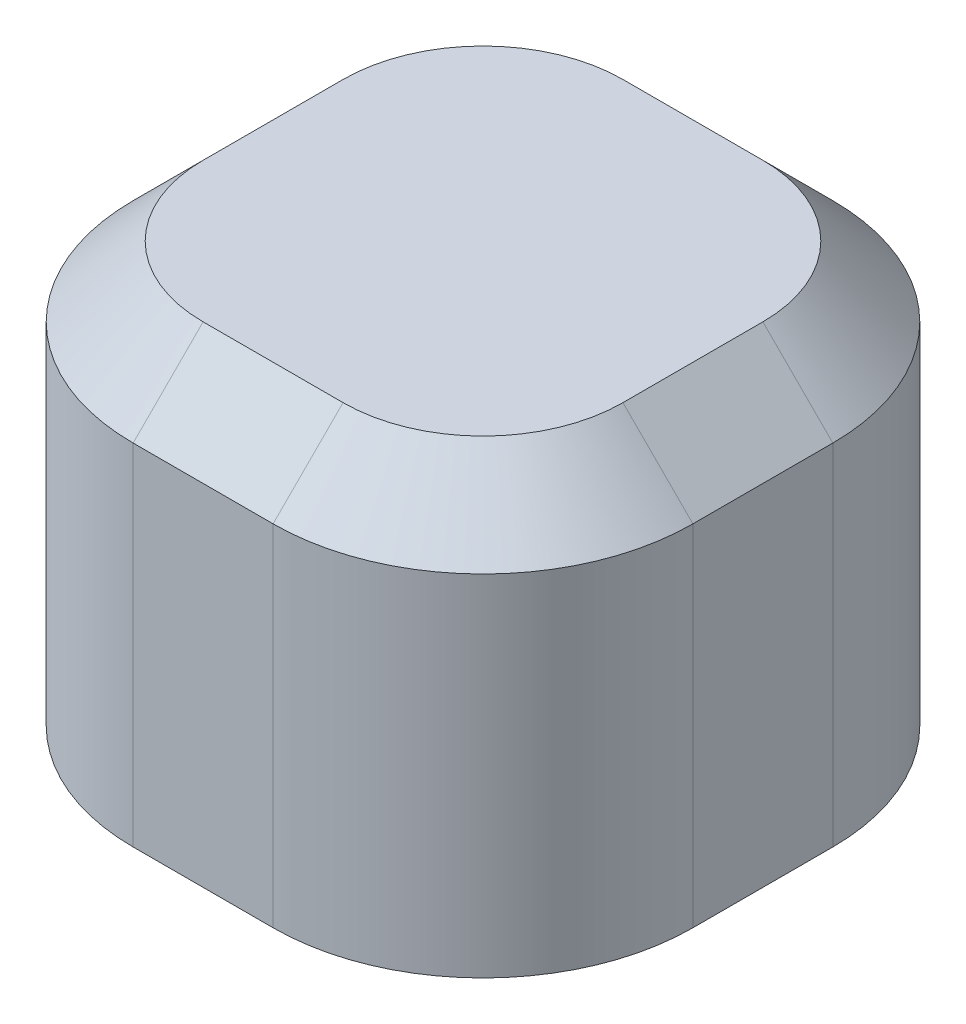
ISO-10303-21;
HEADER;
FILE_DESCRIPTION(('STEP AP214'),'2;1');
FILE_NAME('part.step','',(''),(''),'','','');
FILE_SCHEMA(('AUTOMOTIVE_DESIGN { 1 0 10303 214 1 1 1 1 }'));
ENDSEC;
DATA;
#1=APPLICATION_CONTEXT('core data for automotive mechanical design processes');
#2=APPLICATION_PROTOCOL_DEFINITION('international standard','automotive_design',2000,#1);
#3=PRODUCT_CONTEXT('',#1,'mechanical');
#4=PRODUCT('Part','Part','',(#3));
#5=PRODUCT_RELATED_PRODUCT_CATEGORY('part','',(#4));
#6=PRODUCT_DEFINITION_FORMATION('','',#4);
#7=PRODUCT_DEFINITION_CONTEXT('part definition',#1,'design');
#8=PRODUCT_DEFINITION('design','',#6,#7);
#9=PRODUCT_DEFINITION_SHAPE('','',#8);
#10=(LENGTH_UNIT() NAMED_UNIT(*) SI_UNIT(.MILLI.,.METRE.));
#11=(NAMED_UNIT(*) PLANE_ANGLE_UNIT() SI_UNIT($,.RADIAN.));
#12=(NAMED_UNIT(*) SI_UNIT($,.STERADIAN.) SOLID_ANGLE_UNIT());
#13=UNCERTAINTY_MEASURE_WITH_UNIT(LENGTH_MEASURE(1.E-05),#10,'distance_accuracy_value','');
#14=(GEOMETRIC_REPRESENTATION_CONTEXT(3) GLOBAL_UNCERTAINTY_ASSIGNED_CONTEXT((#13)) GLOBAL_UNIT_ASSIGNED_CONTEXT((#10,
#11,#12)) REPRESENTATION_CONTEXT('',''));
#15=CARTESIAN_POINT('',(0.,0.,0.));
#16=DIRECTION('',(0.,0.,1.));
#17=DIRECTION('',(1.,0.,0.));
#18=AXIS2_PLACEMENT_3D('',#15,#16,#17);
#19=CARTESIAN_POINT('',(0.,3.,0.));
#20=DIRECTION('',(1.,0.,0.));
#21=DIRECTION('',(0.,0.,-1.));
#22=AXIS2_PLACEMENT_3D('',#19,#20,#21);
#23=PLANE('',#22);
#24=DIRECTION('',(0.,-1.,0.));
#25=VECTOR('',#24,1.);
#26=CARTESIAN_POINT('',(0.,3.,-1.5));
#27=LINE('',#26,#25);
#28=CARTESIAN_POINT('',(0.,0.,-1.5));
#29=VERTEX_POINT('',#28);
#30=CARTESIAN_POINT('',(0.,2.5,-1.5));
#31=VERTEX_POINT('',#30);
#32=EDGE_CURVE('E223',#29,#31,#27,.F.);
#33=ORIENTED_EDGE('',*,*,#32,.T.);
#34=DIRECTION('',(0.,0.,-1.));
#35=VECTOR('',#34,1.);
#36=CARTESIAN_POINT('',(0.,2.5,0.));
#37=LINE('',#36,#35);
#38=CARTESIAN_POINT('',(0.,2.5,-2.5));
#39=VERTEX_POINT('',#38);
#40=EDGE_CURVE('E252',#31,#39,#37,.T.);
#41=ORIENTED_EDGE('',*,*,#40,.T.);
#42=DIRECTION('',(0.,-1.,0.));
#43=VECTOR('',#42,1.);
#44=CARTESIAN_POINT('',(0.,3.,-2.5));
#45=LINE('',#44,#43);
#46=CARTESIAN_POINT('',(0.,0.,-2.5));
#47=VERTEX_POINT('',#46);
#48=EDGE_CURVE('E221',#39,#47,#45,.T.);
#49=ORIENTED_EDGE('',*,*,#48,.T.);
#50=DIRECTION('',(0.,0.,1.));
#51=VECTOR('',#50,1.);
#52=CARTESIAN_POINT('',(0.,0.,0.));
#53=LINE('',#52,#51);
#54=EDGE_CURVE('E193',#47,#29,#53,.T.);
#55=ORIENTED_EDGE('',*,*,#54,.T.);
#56=EDGE_LOOP('',(#33,#41,#49,#55));
#57=FACE_BOUND('',#56,.T.);
#58=ADVANCED_FACE('F39',(#57),#23,.F.);
#59=CARTESIAN_POINT('',(0.,3.,0.));
#60=DIRECTION('',(0.,0.,-1.));
#61=DIRECTION('',(-1.,0.,0.));
#62=AXIS2_PLACEMENT_3D('',#59,#60,#61);
#63=PLANE('',#62);
#64=DIRECTION('',(0.,-1.,0.));
#65=VECTOR('',#64,1.);
#66=CARTESIAN_POINT('',(2.5,3.,0.));
#67=LINE('',#66,#65);
#68=CARTESIAN_POINT('',(2.5,0.,0.));
#69=VERTEX_POINT('',#68);
#70=CARTESIAN_POINT('',(2.5,2.5,0.));
#71=VERTEX_POINT('',#70);
#72=EDGE_CURVE('E208',#69,#71,#67,.F.);
#73=ORIENTED_EDGE('',*,*,#72,.T.);
#74=DIRECTION('',(-1.,0.,0.));
#75=VECTOR('',#74,1.);
#76=CARTESIAN_POINT('',(0.,2.5,0.));
#77=LINE('',#76,#75);
#78=CARTESIAN_POINT('',(1.5,2.5,0.));
#79=VERTEX_POINT('',#78);
#80=EDGE_CURVE('E259',#71,#79,#77,.T.);
#81=ORIENTED_EDGE('',*,*,#80,.T.);
#82=DIRECTION('',(0.,-1.,0.));
#83=VECTOR('',#82,1.);
#84=CARTESIAN_POINT('',(1.5,3.,0.));
#85=LINE('',#84,#83);
#86=CARTESIAN_POINT('',(1.5,0.,0.));
#87=VERTEX_POINT('',#86);
#88=EDGE_CURVE('E211',#79,#87,#85,.T.);
#89=ORIENTED_EDGE('',*,*,#88,.T.);
#90=DIRECTION('',(1.,0.,0.));
#91=VECTOR('',#90,1.);
#92=CARTESIAN_POINT('',(0.,0.,0.));
#93=LINE('',#92,#91);
#94=EDGE_CURVE('E199',#87,#69,#93,.T.);
#95=ORIENTED_EDGE('',*,*,#94,.T.);
#96=EDGE_LOOP('',(#73,#81,#89,#95));
#97=FACE_BOUND('',#96,.T.);
#98=ADVANCED_FACE('F303',(#97),#63,.F.);
#99=CARTESIAN_POINT('',(4.,3.,0.));
#100=DIRECTION('',(-1.,0.,0.));
#101=DIRECTION('',(0.,0.,1.));
#102=AXIS2_PLACEMENT_3D('',#99,#100,#101);
#103=PLANE('',#102);
#104=DIRECTION('',(0.,-1.,0.));
#105=VECTOR('',#104,1.);
#106=CARTESIAN_POINT('',(4.,3.,-2.5));
#107=LINE('',#106,#105);
#108=CARTESIAN_POINT('',(4.,0.,-2.5));
#109=VERTEX_POINT('',#108);
#110=CARTESIAN_POINT('',(4.,2.5,-2.5));
#111=VERTEX_POINT('',#110);
#112=EDGE_CURVE('E233',#109,#111,#107,.F.);
#113=ORIENTED_EDGE('',*,*,#112,.T.);
#114=DIRECTION('',(0.,0.,1.));
#115=VECTOR('',#114,1.);
#116=CARTESIAN_POINT('',(4.,2.5,0.));
#117=LINE('',#116,#115);
#118=CARTESIAN_POINT('',(4.,2.5,-1.5));
#119=VERTEX_POINT('',#118);
#120=EDGE_CURVE('E11',#111,#119,#117,.T.);
#121=ORIENTED_EDGE('',*,*,#120,.T.);
#122=DIRECTION('',(0.,-1.,0.));
#123=VECTOR('',#122,1.);
#124=CARTESIAN_POINT('',(4.,3.,-1.5));
#125=LINE('',#124,#123);
#126=CARTESIAN_POINT('',(4.,0.,-1.5));
#127=VERTEX_POINT('',#126);
#128=EDGE_CURVE('E231',#119,#127,#125,.T.);
#129=ORIENTED_EDGE('',*,*,#128,.T.);
#130=DIRECTION('',(0.,0.,-1.));
#131=VECTOR('',#130,1.);
#132=CARTESIAN_POINT('',(4.,0.,0.));
#133=LINE('',#132,#131);
#134=EDGE_CURVE('E202',#127,#109,#133,.T.);
#135=ORIENTED_EDGE('',*,*,#134,.T.);
#136=EDGE_LOOP('',(#113,#121,#129,#135));
#137=FACE_BOUND('',#136,.T.);
#138=ADVANCED_FACE('F313',(#137),#103,.F.);
#139=CARTESIAN_POINT('',(0.,3.,-4.));
#140=DIRECTION('',(0.,0.,1.));
#141=DIRECTION('',(1.,0.,0.));
#142=AXIS2_PLACEMENT_3D('',#139,#140,#141);
#143=PLANE('',#142);
#144=DIRECTION('',(0.,-1.,0.));
#145=VECTOR('',#144,1.);
#146=CARTESIAN_POINT('',(1.5,3.,-4.));
#147=LINE('',#146,#145);
#148=CARTESIAN_POINT('',(1.5,0.,-4.));
#149=VERTEX_POINT('',#148);
#150=CARTESIAN_POINT('',(1.5,2.5,-4.));
#151=VERTEX_POINT('',#150);
#152=EDGE_CURVE('E228',#149,#151,#147,.F.);
#153=ORIENTED_EDGE('',*,*,#152,.T.);
#154=DIRECTION('',(1.,0.,0.));
#155=VECTOR('',#154,1.);
#156=CARTESIAN_POINT('',(0.,2.5,-4.));
#157=LINE('',#156,#155);
#158=CARTESIAN_POINT('',(2.5,2.5,-4.));
#159=VERTEX_POINT('',#158);
#160=EDGE_CURVE('E261',#151,#159,#157,.T.);
#161=ORIENTED_EDGE('',*,*,#160,.T.);
#162=DIRECTION('',(0.,-1.,0.));
#163=VECTOR('',#162,1.);
#164=CARTESIAN_POINT('',(2.5,3.,-4.));
#165=LINE('',#164,#163);
#166=CARTESIAN_POINT('',(2.5,0.,-4.));
#167=VERTEX_POINT('',#166);
#168=EDGE_CURVE('E226',#159,#167,#165,.T.);
#169=ORIENTED_EDGE('',*,*,#168,.T.);
#170=DIRECTION('',(-1.,0.,0.));
#171=VECTOR('',#170,1.);
#172=CARTESIAN_POINT('',(0.,0.,-4.));
#173=LINE('',#172,#171);
#174=EDGE_CURVE('E205',#167,#149,#173,.T.);
#175=ORIENTED_EDGE('',*,*,#174,.T.);
#176=EDGE_LOOP('',(#153,#161,#169,#175));
#177=FACE_BOUND('',#176,.T.);
#178=ADVANCED_FACE('F318',(#177),#143,.F.);
#179=CARTESIAN_POINT('',(0.,3.,0.));
#180=DIRECTION('',(0.,-1.,0.));
#181=DIRECTION('',(0.,0.,-1.));
#182=AXIS2_PLACEMENT_3D('',#179,#180,#181);
#183=PLANE('',#182);
#184=CARTESIAN_POINT('',(1.5,3.,-2.5));
#185=DIRECTION('',(0.,-1.,0.));
#186=DIRECTION('',(0.,0.,-1.));
#187=AXIS2_PLACEMENT_3D('',#184,#185,#186);
#188=CIRCLE('',#187,1.);
#189=CARTESIAN_POINT('',(1.5,3.,-3.5));
#190=VERTEX_POINT('',#189);
#191=CARTESIAN_POINT('',(0.499999999999999,3.,-2.5));
#192=VERTEX_POINT('',#191);
#193=EDGE_CURVE('E245',#190,#192,#188,.F.);
#194=ORIENTED_EDGE('',*,*,#193,.T.);
#195=DIRECTION('',(0.,0.,1.));
#196=VECTOR('',#195,1.);
#197=CARTESIAN_POINT('',(0.499999999999999,3.,0.));
#198=LINE('',#197,#196);
#199=CARTESIAN_POINT('',(0.499999999999999,3.,-1.5));
#200=VERTEX_POINT('',#199);
#201=EDGE_CURVE('E249',#192,#200,#198,.T.);
#202=ORIENTED_EDGE('',*,*,#201,.T.);
#203=CARTESIAN_POINT('',(1.5,3.,-1.5));
#204=DIRECTION('',(0.,-1.,0.));
#205=DIRECTION('',(0.,0.,-1.));
#206=AXIS2_PLACEMENT_3D('',#203,#204,#205);
#207=CIRCLE('',#206,1.);
#208=CARTESIAN_POINT('',(1.5,3.,-0.499999999999999));
#209=VERTEX_POINT('',#208);
#210=EDGE_CURVE('E247',#200,#209,#207,.F.);
#211=ORIENTED_EDGE('',*,*,#210,.T.);
#212=DIRECTION('',(1.,0.,0.));
#213=VECTOR('',#212,1.);
#214=CARTESIAN_POINT('',(0.,3.,-0.499999999999999));
#215=LINE('',#214,#213);
#216=CARTESIAN_POINT('',(2.5,3.,-0.499999999999999));
#217=VERTEX_POINT('',#216);
#218=EDGE_CURVE('E243',#209,#217,#215,.T.);
#219=ORIENTED_EDGE('',*,*,#218,.T.);
#220=CARTESIAN_POINT('',(2.5,3.,-1.5));
#221=DIRECTION('',(0.,-1.,0.));
#222=DIRECTION('',(0.,0.,-1.));
#223=AXIS2_PLACEMENT_3D('',#220,#221,#222);
#224=CIRCLE('',#223,1.);
#225=CARTESIAN_POINT('',(3.5,3.,-1.5));
#226=VERTEX_POINT('',#225);
#227=EDGE_CURVE('E239',#217,#226,#224,.F.);
#228=ORIENTED_EDGE('',*,*,#227,.T.);
#229=DIRECTION('',(0.,0.,-1.));
#230=VECTOR('',#229,1.);
#231=CARTESIAN_POINT('',(3.5,3.,0.));
#232=LINE('',#231,#230);
#233=CARTESIAN_POINT('',(3.5,3.,-2.5));
#234=VERTEX_POINT('',#233);
#235=EDGE_CURVE('E235',#226,#234,#232,.T.);
#236=ORIENTED_EDGE('',*,*,#235,.T.);
#237=CARTESIAN_POINT('',(2.5,3.,-2.5));
#238=DIRECTION('',(0.,-1.,0.));
#239=DIRECTION('',(0.,0.,-1.));
#240=AXIS2_PLACEMENT_3D('',#237,#238,#239);
#241=CIRCLE('',#240,1.);
#242=CARTESIAN_POINT('',(2.5,3.,-3.5));
#243=VERTEX_POINT('',#242);
#244=EDGE_CURVE('E237',#234,#243,#241,.F.);
#245=ORIENTED_EDGE('',*,*,#244,.T.);
#246=DIRECTION('',(-1.,0.,0.));
#247=VECTOR('',#246,1.);
#248=CARTESIAN_POINT('',(0.,3.,-3.5));
#249=LINE('',#248,#247);
#250=EDGE_CURVE('E241',#243,#190,#249,.T.);
#251=ORIENTED_EDGE('',*,*,#250,.T.);
#252=EDGE_LOOP('',(#194,#202,#211,#219,#228,#236,#245,#251));
#253=FACE_BOUND('',#252,.T.);
#254=ADVANCED_FACE('F343',(#253),#183,.F.);
#255=CARTESIAN_POINT('',(0.,0.,0.));
#256=DIRECTION('',(0.,-1.,0.));
#257=DIRECTION('',(0.,0.,-1.));
#258=AXIS2_PLACEMENT_3D('',#255,#256,#257);
#259=PLANE('',#258);
#260=DIRECTION('',(0.,0.,1.));
#261=VECTOR('',#260,1.);
#262=CARTESIAN_POINT('',(3.5,0.,-0.499999999999998));
#263=LINE('',#262,#261);
#264=CARTESIAN_POINT('',(3.5,0.,-3.5));
#265=VERTEX_POINT('',#264);
#266=CARTESIAN_POINT('',(3.5,0.,-0.499999999999998));
#267=VERTEX_POINT('',#266);
#268=EDGE_CURVE('E161',#265,#267,#263,.T.);
#269=ORIENTED_EDGE('',*,*,#268,.F.);
#270=DIRECTION('',(1.,0.,0.));
#271=VECTOR('',#270,1.);
#272=CARTESIAN_POINT('',(0.500000000000001,0.,-3.5));
#273=LINE('',#272,#271);
#274=CARTESIAN_POINT('',(0.500000000000001,0.,-3.5));
#275=VERTEX_POINT('',#274);
#276=EDGE_CURVE('E178',#275,#265,#273,.T.);
#277=ORIENTED_EDGE('',*,*,#276,.F.);
#278=DIRECTION('',(0.,0.,-1.));
#279=VECTOR('',#278,1.);
#280=CARTESIAN_POINT('',(0.500000000000001,0.,-0.499999999999998));
#281=LINE('',#280,#279);
#282=CARTESIAN_POINT('',(0.500000000000001,0.,-0.499999999999998));
#283=VERTEX_POINT('',#282);
#284=EDGE_CURVE('E181',#283,#275,#281,.T.);
#285=ORIENTED_EDGE('',*,*,#284,.F.);
#286=DIRECTION('',(-1.,0.,0.));
#287=VECTOR('',#286,1.);
#288=CARTESIAN_POINT('',(0.500000000000001,0.,-0.499999999999998));
#289=LINE('',#288,#287);
#290=EDGE_CURVE('E187',#267,#283,#289,.T.);
#291=ORIENTED_EDGE('',*,*,#290,.F.);
#292=EDGE_LOOP('',(#269,#277,#285,#291));
#293=FACE_BOUND('',#292,.T.);
#294=ORIENTED_EDGE('',*,*,#94,.F.);
#295=CARTESIAN_POINT('',(1.5,0.,-1.5));
#296=DIRECTION('',(0.,-1.,0.));
#297=DIRECTION('',(0.,0.,-1.));
#298=AXIS2_PLACEMENT_3D('',#295,#296,#297);
#299=CIRCLE('',#298,1.5);
#300=EDGE_CURVE('E219',#87,#29,#299,.T.);
#301=ORIENTED_EDGE('',*,*,#300,.T.);
#302=ORIENTED_EDGE('',*,*,#54,.F.);
#303=CARTESIAN_POINT('',(1.5,0.,-2.5));
#304=DIRECTION('',(0.,-1.,0.));
#305=DIRECTION('',(0.,0.,-1.));
#306=AXIS2_PLACEMENT_3D('',#303,#304,#305);
#307=CIRCLE('',#306,1.5);
#308=EDGE_CURVE('E217',#47,#149,#307,.T.);
#309=ORIENTED_EDGE('',*,*,#308,.T.);
#310=ORIENTED_EDGE('',*,*,#174,.F.);
#311=CARTESIAN_POINT('',(2.5,0.,-2.5));
#312=DIRECTION('',(0.,-1.,0.));
#313=DIRECTION('',(0.,0.,-1.));
#314=AXIS2_PLACEMENT_3D('',#311,#312,#313);
#315=CIRCLE('',#314,1.5);
#316=EDGE_CURVE('E215',#167,#109,#315,.T.);
#317=ORIENTED_EDGE('',*,*,#316,.T.);
#318=ORIENTED_EDGE('',*,*,#134,.F.);
#319=CARTESIAN_POINT('',(2.5,0.,-1.5));
#320=DIRECTION('',(0.,-1.,0.));
#321=DIRECTION('',(0.,0.,-1.));
#322=AXIS2_PLACEMENT_3D('',#319,#320,#321);
#323=CIRCLE('',#322,1.5);
#324=EDGE_CURVE('E213',#127,#69,#323,.T.);
#325=ORIENTED_EDGE('',*,*,#324,.T.);
#326=EDGE_LOOP('',(#294,#301,#302,#309,#310,#317,#318,#325));
#327=FACE_BOUND('',#326,.T.);
#328=ADVANCED_FACE('F308',(#293,#327),#259,.T.);
#329=CARTESIAN_POINT('',(3.5,1.5,-0.499999999999998));
#330=DIRECTION('',(1.,0.,0.));
#331=DIRECTION('',(0.,0.,-1.));
#332=AXIS2_PLACEMENT_3D('',#329,#330,#331);
#333=PLANE('',#332);
#334=ORIENTED_EDGE('',*,*,#268,.T.);
#335=DIRECTION('',(0.,-1.,0.));
#336=VECTOR('',#335,1.);
#337=CARTESIAN_POINT('',(3.5,1.5,-0.499999999999998));
#338=LINE('',#337,#336);
#339=CARTESIAN_POINT('',(3.5,1.5,-0.499999999999998));
#340=VERTEX_POINT('',#339);
#341=EDGE_CURVE('E154',#340,#267,#338,.T.);
#342=ORIENTED_EDGE('',*,*,#341,.F.);
#343=DIRECTION('',(0.,0.,1.));
#344=VECTOR('',#343,1.);
#345=CARTESIAN_POINT('',(3.5,1.5,-0.499999999999998));
#346=LINE('',#345,#344);
#347=CARTESIAN_POINT('',(3.5,1.5,-3.5));
#348=VERTEX_POINT('',#347);
#349=EDGE_CURVE('E158',#348,#340,#346,.T.);
#350=ORIENTED_EDGE('',*,*,#349,.F.);
#351=DIRECTION('',(0.,-1.,0.));
#352=VECTOR('',#351,1.);
#353=CARTESIAN_POINT('',(3.5,1.5,-3.5));
#354=LINE('',#353,#352);
#355=EDGE_CURVE('E191',#348,#265,#354,.T.);
#356=ORIENTED_EDGE('',*,*,#355,.T.);
#357=EDGE_LOOP('',(#334,#342,#350,#356));
#358=FACE_BOUND('',#357,.T.);
#359=ADVANCED_FACE('F156',(#358),#333,.F.);
#360=CARTESIAN_POINT('',(0.500000000000001,1.5,-3.5));
#361=DIRECTION('',(0.,0.,-1.));
#362=DIRECTION('',(-1.,0.,0.));
#363=AXIS2_PLACEMENT_3D('',#360,#361,#362);
#364=PLANE('',#363);
#365=ORIENTED_EDGE('',*,*,#276,.T.);
#366=ORIENTED_EDGE('',*,*,#355,.F.);
#367=DIRECTION('',(1.,0.,0.));
#368=VECTOR('',#367,1.);
#369=CARTESIAN_POINT('',(0.500000000000001,1.5,-3.5));
#370=LINE('',#369,#368);
#371=CARTESIAN_POINT('',(0.500000000000001,1.5,-3.5));
#372=VERTEX_POINT('',#371);
#373=EDGE_CURVE('E166',#372,#348,#370,.T.);
#374=ORIENTED_EDGE('',*,*,#373,.F.);
#375=DIRECTION('',(0.,-1.,0.));
#376=VECTOR('',#375,1.);
#377=CARTESIAN_POINT('',(0.500000000000001,1.5,-3.5));
#378=LINE('',#377,#376);
#379=EDGE_CURVE('E194',#372,#275,#378,.T.);
#380=ORIENTED_EDGE('',*,*,#379,.T.);
#381=EDGE_LOOP('',(#365,#366,#374,#380));
#382=FACE_BOUND('',#381,.T.);
#383=ADVANCED_FACE('F446',(#382),#364,.F.);
#384=CARTESIAN_POINT('',(0.500000000000001,1.5,-0.499999999999998));
#385=DIRECTION('',(-1.,0.,0.));
#386=DIRECTION('',(0.,0.,1.));
#387=AXIS2_PLACEMENT_3D('',#384,#385,#386);
#388=PLANE('',#387);
#389=ORIENTED_EDGE('',*,*,#284,.T.);
#390=ORIENTED_EDGE('',*,*,#379,.F.);
#391=DIRECTION('',(0.,0.,-1.));
#392=VECTOR('',#391,1.);
#393=CARTESIAN_POINT('',(0.500000000000001,1.5,-0.499999999999998));
#394=LINE('',#393,#392);
#395=CARTESIAN_POINT('',(0.500000000000001,1.5,-0.499999999999998));
#396=VERTEX_POINT('',#395);
#397=EDGE_CURVE('E174',#396,#372,#394,.T.);
#398=ORIENTED_EDGE('',*,*,#397,.F.);
#399=DIRECTION('',(0.,-1.,0.));
#400=VECTOR('',#399,1.);
#401=CARTESIAN_POINT('',(0.500000000000001,1.5,-0.499999999999998));
#402=LINE('',#401,#400);
#403=EDGE_CURVE('E165',#396,#283,#402,.T.);
#404=ORIENTED_EDGE('',*,*,#403,.T.);
#405=EDGE_LOOP('',(#389,#390,#398,#404));
#406=FACE_BOUND('',#405,.T.);
#407=ADVANCED_FACE('F439',(#406),#388,.F.);
#408=CARTESIAN_POINT('',(0.500000000000001,1.5,-0.499999999999998));
#409=DIRECTION('',(0.,0.,1.));
#410=DIRECTION('',(1.,0.,0.));
#411=AXIS2_PLACEMENT_3D('',#408,#409,#410);
#412=PLANE('',#411);
#413=ORIENTED_EDGE('',*,*,#290,.T.);
#414=ORIENTED_EDGE('',*,*,#403,.F.);
#415=DIRECTION('',(-1.,0.,0.));
#416=VECTOR('',#415,1.);
#417=CARTESIAN_POINT('',(0.500000000000001,1.5,-0.499999999999998));
#418=LINE('',#417,#416);
#419=EDGE_CURVE('E169',#340,#396,#418,.T.);
#420=ORIENTED_EDGE('',*,*,#419,.F.);
#421=ORIENTED_EDGE('',*,*,#341,.T.);
#422=EDGE_LOOP('',(#413,#414,#420,#421));
#423=FACE_BOUND('',#422,.T.);
#424=ADVANCED_FACE('F170',(#423),#412,.F.);
#425=CARTESIAN_POINT('',(0.,1.5,0.));
#426=DIRECTION('',(0.,-1.,0.));
#427=DIRECTION('',(0.,0.,-1.));
#428=AXIS2_PLACEMENT_3D('',#425,#426,#427);
#429=PLANE('',#428);
#430=ORIENTED_EDGE('',*,*,#349,.T.);
#431=ORIENTED_EDGE('',*,*,#419,.T.);
#432=ORIENTED_EDGE('',*,*,#397,.T.);
#433=ORIENTED_EDGE('',*,*,#373,.T.);
#434=EDGE_LOOP('',(#430,#431,#432,#433));
#435=FACE_BOUND('',#434,.T.);
#436=ADVANCED_FACE('F176',(#435),#429,.T.);
#437=CARTESIAN_POINT('',(1.5,3.,-1.5));
#438=DIRECTION('',(0.,-1.,0.));
#439=DIRECTION('',(0.,0.,-1.));
#440=AXIS2_PLACEMENT_3D('',#437,#438,#439);
#441=CYLINDRICAL_SURFACE('',#440,1.5);
#442=ORIENTED_EDGE('',*,*,#88,.F.);
#443=CARTESIAN_POINT('',(1.5,2.5,-1.5));
#444=DIRECTION('',(0.,-1.,0.));
#445=DIRECTION('',(0.,0.,-1.));
#446=AXIS2_PLACEMENT_3D('',#443,#444,#445);
#447=CIRCLE('',#446,1.5);
#448=EDGE_CURVE('E255',#79,#31,#447,.T.);
#449=ORIENTED_EDGE('',*,*,#448,.T.);
#450=ORIENTED_EDGE('',*,*,#32,.F.);
#451=ORIENTED_EDGE('',*,*,#300,.F.);
#452=EDGE_LOOP('',(#442,#449,#450,#451));
#453=FACE_BOUND('',#452,.T.);
#454=ADVANCED_FACE('F366',(#453),#441,.T.);
#455=CARTESIAN_POINT('',(1.5,3.,-2.5));
#456=DIRECTION('',(0.,-1.,0.));
#457=DIRECTION('',(0.,0.,-1.));
#458=AXIS2_PLACEMENT_3D('',#455,#456,#457);
#459=CYLINDRICAL_SURFACE('',#458,1.5);
#460=ORIENTED_EDGE('',*,*,#48,.F.);
#461=CARTESIAN_POINT('',(1.5,2.5,-2.5));
#462=DIRECTION('',(0.,-1.,0.));
#463=DIRECTION('',(0.,0.,-1.));
#464=AXIS2_PLACEMENT_3D('',#461,#462,#463);
#465=CIRCLE('',#464,1.5);
#466=EDGE_CURVE('E257',#39,#151,#465,.T.);
#467=ORIENTED_EDGE('',*,*,#466,.T.);
#468=ORIENTED_EDGE('',*,*,#152,.F.);
#469=ORIENTED_EDGE('',*,*,#308,.F.);
#470=EDGE_LOOP('',(#460,#467,#468,#469));
#471=FACE_BOUND('',#470,.T.);
#472=ADVANCED_FACE('F322',(#471),#459,.T.);
#473=CARTESIAN_POINT('',(2.5,3.,-2.5));
#474=DIRECTION('',(0.,-1.,0.));
#475=DIRECTION('',(0.,0.,-1.));
#476=AXIS2_PLACEMENT_3D('',#473,#474,#475);
#477=CYLINDRICAL_SURFACE('',#476,1.5);
#478=ORIENTED_EDGE('',*,*,#168,.F.);
#479=CARTESIAN_POINT('',(2.5,2.5,-2.5));
#480=DIRECTION('',(0.,-1.,0.));
#481=DIRECTION('',(0.,0.,-1.));
#482=AXIS2_PLACEMENT_3D('',#479,#480,#481);
#483=CIRCLE('',#482,1.5);
#484=EDGE_CURVE('E49',#159,#111,#483,.T.);
#485=ORIENTED_EDGE('',*,*,#484,.T.);
#486=ORIENTED_EDGE('',*,*,#112,.F.);
#487=ORIENTED_EDGE('',*,*,#316,.F.);
#488=EDGE_LOOP('',(#478,#485,#486,#487));
#489=FACE_BOUND('',#488,.T.);
#490=ADVANCED_FACE('F314',(#489),#477,.T.);
#491=CARTESIAN_POINT('',(2.5,3.,-1.5));
#492=DIRECTION('',(0.,-1.,0.));
#493=DIRECTION('',(0.,0.,-1.));
#494=AXIS2_PLACEMENT_3D('',#491,#492,#493);
#495=CYLINDRICAL_SURFACE('',#494,1.5);
#496=ORIENTED_EDGE('',*,*,#128,.F.);
#497=CARTESIAN_POINT('',(2.5,2.5,-1.5));
#498=DIRECTION('',(0.,-1.,0.));
#499=DIRECTION('',(0.,0.,-1.));
#500=AXIS2_PLACEMENT_3D('',#497,#498,#499);
#501=CIRCLE('',#500,1.5);
#502=EDGE_CURVE('E263',#119,#71,#501,.T.);
#503=ORIENTED_EDGE('',*,*,#502,.T.);
#504=ORIENTED_EDGE('',*,*,#72,.F.);
#505=ORIENTED_EDGE('',*,*,#324,.F.);
#506=EDGE_LOOP('',(#496,#503,#504,#505));
#507=FACE_BOUND('',#506,.T.);
#508=ADVANCED_FACE('F300',(#507),#495,.T.);
#509=CARTESIAN_POINT('',(3.5,3.,0.));
#510=DIRECTION('',(-0.707106781186549,-0.707106781186546,0.));
#511=DIRECTION('',(0.,0.,-1.));
#512=AXIS2_PLACEMENT_3D('',#509,#510,#511);
#513=PLANE('',#512);
#514=DIRECTION('',(-0.707106781186546,0.707106781186549,0.));
#515=VECTOR('',#514,1.);
#516=CARTESIAN_POINT('',(4.,2.5,-1.5));
#517=LINE('',#516,#515);
#518=EDGE_CURVE('E281',#119,#226,#517,.T.);
#519=ORIENTED_EDGE('',*,*,#518,.F.);
#520=ORIENTED_EDGE('',*,*,#120,.F.);
#521=DIRECTION('',(0.707106781186547,-0.707106781186548,0.));
#522=VECTOR('',#521,1.);
#523=CARTESIAN_POINT('',(3.5,3.,-2.5));
#524=LINE('',#523,#522);
#525=EDGE_CURVE('E44',#234,#111,#524,.T.);
#526=ORIENTED_EDGE('',*,*,#525,.F.);
#527=ORIENTED_EDGE('',*,*,#235,.F.);
#528=EDGE_LOOP('',(#519,#520,#526,#527));
#529=FACE_BOUND('',#528,.T.);
#530=ADVANCED_FACE('F42',(#529),#513,.F.);
#531=CARTESIAN_POINT('',(2.5,3.,-2.5));
#532=DIRECTION('',(0.,-1.,0.));
#533=DIRECTION('',(0.,0.,-1.));
#534=AXIS2_PLACEMENT_3D('',#531,#532,#533);
#535=CONICAL_SURFACE('',#534,1.,0.785398163397447);
#536=ORIENTED_EDGE('',*,*,#525,.T.);
#537=ORIENTED_EDGE('',*,*,#484,.F.);
#538=DIRECTION('',(0.,-0.707106781186549,-0.707106781186546));
#539=VECTOR('',#538,1.);
#540=CARTESIAN_POINT('',(2.5,3.,-3.5));
#541=LINE('',#540,#539);
#542=EDGE_CURVE('E279',#243,#159,#541,.T.);
#543=ORIENTED_EDGE('',*,*,#542,.F.);
#544=ORIENTED_EDGE('',*,*,#244,.F.);
#545=EDGE_LOOP('',(#536,#537,#543,#544));
#546=FACE_BOUND('',#545,.T.);
#547=ADVANCED_FACE('F291',(#546),#535,.T.);
#548=CARTESIAN_POINT('',(2.5,3.,-1.5));
#549=DIRECTION('',(0.,-1.,0.));
#550=DIRECTION('',(0.,0.,-1.));
#551=AXIS2_PLACEMENT_3D('',#548,#549,#550);
#552=CONICAL_SURFACE('',#551,1.,0.785398163397447);
#553=ORIENTED_EDGE('',*,*,#518,.T.);
#554=ORIENTED_EDGE('',*,*,#227,.F.);
#555=DIRECTION('',(0.,0.707106781186549,-0.707106781186546));
#556=VECTOR('',#555,1.);
#557=CARTESIAN_POINT('',(2.5,2.5,0.));
#558=LINE('',#557,#556);
#559=EDGE_CURVE('E276',#71,#217,#558,.T.);
#560=ORIENTED_EDGE('',*,*,#559,.F.);
#561=ORIENTED_EDGE('',*,*,#502,.F.);
#562=EDGE_LOOP('',(#553,#554,#560,#561));
#563=FACE_BOUND('',#562,.T.);
#564=ADVANCED_FACE('F296',(#563),#552,.T.);
#565=CARTESIAN_POINT('',(0.,3.,-3.5));
#566=DIRECTION('',(0.,-0.707106781186546,0.707106781186549));
#567=DIRECTION('',(-1.,0.,0.));
#568=AXIS2_PLACEMENT_3D('',#565,#566,#567);
#569=PLANE('',#568);
#570=ORIENTED_EDGE('',*,*,#542,.T.);
#571=ORIENTED_EDGE('',*,*,#160,.F.);
#572=DIRECTION('',(0.,-0.707106781186549,-0.707106781186546));
#573=VECTOR('',#572,1.);
#574=CARTESIAN_POINT('',(1.5,3.,-3.5));
#575=LINE('',#574,#573);
#576=EDGE_CURVE('E273',#190,#151,#575,.T.);
#577=ORIENTED_EDGE('',*,*,#576,.F.);
#578=ORIENTED_EDGE('',*,*,#250,.F.);
#579=EDGE_LOOP('',(#570,#571,#577,#578));
#580=FACE_BOUND('',#579,.T.);
#581=ADVANCED_FACE('F346',(#580),#569,.F.);
#582=CARTESIAN_POINT('',(0.,3.,-0.499999999999999));
#583=DIRECTION('',(0.,-0.707106781186546,-0.707106781186549));
#584=DIRECTION('',(1.,0.,0.));
#585=AXIS2_PLACEMENT_3D('',#582,#583,#584);
#586=PLANE('',#585);
#587=ORIENTED_EDGE('',*,*,#559,.T.);
#588=ORIENTED_EDGE('',*,*,#218,.F.);
#589=DIRECTION('',(0.,0.707106781186549,-0.707106781186546));
#590=VECTOR('',#589,1.);
#591=CARTESIAN_POINT('',(1.5,2.5,0.));
#592=LINE('',#591,#590);
#593=EDGE_CURVE('E270',#79,#209,#592,.T.);
#594=ORIENTED_EDGE('',*,*,#593,.F.);
#595=ORIENTED_EDGE('',*,*,#80,.F.);
#596=EDGE_LOOP('',(#587,#588,#594,#595));
#597=FACE_BOUND('',#596,.T.);
#598=ADVANCED_FACE('F348',(#597),#586,.F.);
#599=CARTESIAN_POINT('',(1.5,3.,-2.5));
#600=DIRECTION('',(0.,-1.,0.));
#601=DIRECTION('',(0.,0.,-1.));
#602=AXIS2_PLACEMENT_3D('',#599,#600,#601);
#603=CONICAL_SURFACE('',#602,1.,0.785398163397447);
#604=ORIENTED_EDGE('',*,*,#576,.T.);
#605=ORIENTED_EDGE('',*,*,#466,.F.);
#606=DIRECTION('',(-0.707106781186546,-0.707106781186549,0.));
#607=VECTOR('',#606,1.);
#608=CARTESIAN_POINT('',(0.499999999999999,3.,-2.5));
#609=LINE('',#608,#607);
#610=EDGE_CURVE('E268',#192,#39,#609,.T.);
#611=ORIENTED_EDGE('',*,*,#610,.F.);
#612=ORIENTED_EDGE('',*,*,#193,.F.);
#613=EDGE_LOOP('',(#604,#605,#611,#612));
#614=FACE_BOUND('',#613,.T.);
#615=ADVANCED_FACE('F326',(#614),#603,.T.);
#616=CARTESIAN_POINT('',(1.5,3.,-1.5));
#617=DIRECTION('',(0.,-1.,0.));
#618=DIRECTION('',(0.,0.,-1.));
#619=AXIS2_PLACEMENT_3D('',#616,#617,#618);
#620=CONICAL_SURFACE('',#619,1.,0.785398163397447);
#621=ORIENTED_EDGE('',*,*,#593,.T.);
#622=ORIENTED_EDGE('',*,*,#210,.F.);
#623=DIRECTION('',(0.707106781186546,0.707106781186549,0.));
#624=VECTOR('',#623,1.);
#625=CARTESIAN_POINT('',(0.,2.5,-1.5));
#626=LINE('',#625,#624);
#627=EDGE_CURVE('E266',#31,#200,#626,.T.);
#628=ORIENTED_EDGE('',*,*,#627,.F.);
#629=ORIENTED_EDGE('',*,*,#448,.F.);
#630=EDGE_LOOP('',(#621,#622,#628,#629));
#631=FACE_BOUND('',#630,.T.);
#632=ADVANCED_FACE('F339',(#631),#620,.T.);
#633=CARTESIAN_POINT('',(0.499999999999999,3.,0.));
#634=DIRECTION('',(0.707106781186549,-0.707106781186546,0.));
#635=DIRECTION('',(0.,0.,1.));
#636=AXIS2_PLACEMENT_3D('',#633,#634,#635);
#637=PLANE('',#636);
#638=ORIENTED_EDGE('',*,*,#610,.T.);
#639=ORIENTED_EDGE('',*,*,#40,.F.);
#640=ORIENTED_EDGE('',*,*,#627,.T.);
#641=ORIENTED_EDGE('',*,*,#201,.F.);
#642=EDGE_LOOP('',(#638,#639,#640,#641));
#643=FACE_BOUND('',#642,.T.);
#644=ADVANCED_FACE('F335',(#643),#637,.F.);
#645=CLOSED_SHELL('',(#58,#98,#138,#178,#254,#328,#359,#383,#407,#424,#436,#454,#472,#490,#508,
#530,#547,#564,#581,#598,#615,#632,#644));
#646=MANIFOLD_SOLID_BREP('B2',#645);
#647=ADVANCED_BREP_SHAPE_REPRESENTATION('',(#18,#646),#14);
#648=SHAPE_DEFINITION_REPRESENTATION(#9,#647);
ENDSEC;
END-ISO-10303-21;
